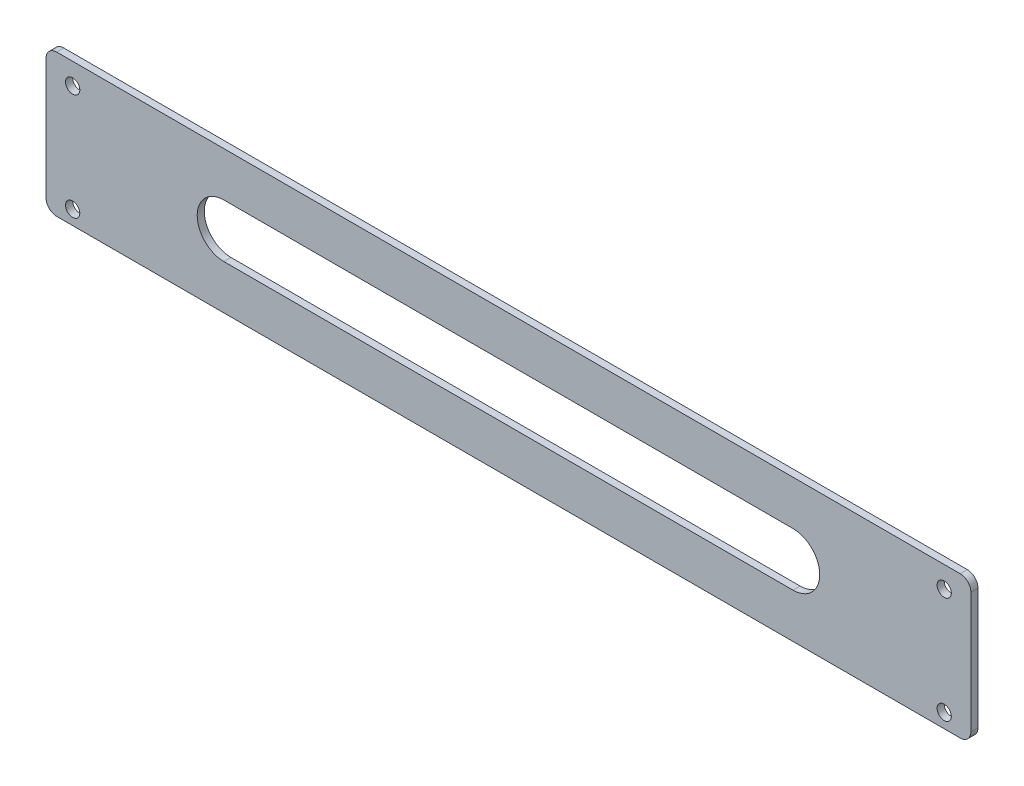
ISO-10303-21;
HEADER;
FILE_DESCRIPTION(('STEP AP214'),'2;1');
FILE_NAME('part.step','',(''),(''),'','','');
FILE_SCHEMA(('AUTOMOTIVE_DESIGN { 1 0 10303 214 1 1 1 1 }'));
ENDSEC;
DATA;
#1=APPLICATION_CONTEXT('core data for automotive mechanical design processes');
#2=APPLICATION_PROTOCOL_DEFINITION('international standard','automotive_design',2000,#1);
#3=PRODUCT_CONTEXT('',#1,'mechanical');
#4=PRODUCT('Part','Part','',(#3));
#5=PRODUCT_RELATED_PRODUCT_CATEGORY('part','',(#4));
#6=PRODUCT_DEFINITION_FORMATION('','',#4);
#7=PRODUCT_DEFINITION_CONTEXT('part definition',#1,'design');
#8=PRODUCT_DEFINITION('design','',#6,#7);
#9=PRODUCT_DEFINITION_SHAPE('','',#8);
#10=(LENGTH_UNIT() NAMED_UNIT(*) SI_UNIT(.MILLI.,.METRE.));
#11=(NAMED_UNIT(*) PLANE_ANGLE_UNIT() SI_UNIT($,.RADIAN.));
#12=(NAMED_UNIT(*) SI_UNIT($,.STERADIAN.) SOLID_ANGLE_UNIT());
#13=UNCERTAINTY_MEASURE_WITH_UNIT(LENGTH_MEASURE(1.E-05),#10,'distance_accuracy_value','');
#14=(GEOMETRIC_REPRESENTATION_CONTEXT(3) GLOBAL_UNCERTAINTY_ASSIGNED_CONTEXT((#13)) GLOBAL_UNIT_ASSIGNED_CONTEXT((#10,
#11,#12)) REPRESENTATION_CONTEXT('',''));
#15=CARTESIAN_POINT('',(0.,0.,0.));
#16=DIRECTION('',(0.,0.,1.));
#17=DIRECTION('',(1.,0.,0.));
#18=AXIS2_PLACEMENT_3D('',#15,#16,#17);
#19=CARTESIAN_POINT('',(130.,20.,2.));
#20=DIRECTION('',(-1.,0.,0.));
#21=DIRECTION('',(0.,0.,1.));
#22=AXIS2_PLACEMENT_3D('',#19,#20,#21);
#23=PLANE('',#22);
#24=DIRECTION('',(0.,1.,0.));
#25=VECTOR('',#24,1.);
#26=CARTESIAN_POINT('',(130.,20.,2.));
#27=LINE('',#26,#25);
#28=CARTESIAN_POINT('',(130.,-17.,2.));
#29=VERTEX_POINT('',#28);
#30=CARTESIAN_POINT('',(130.,17.,2.));
#31=VERTEX_POINT('',#30);
#32=EDGE_CURVE('E192',#29,#31,#27,.T.);
#33=ORIENTED_EDGE('',*,*,#32,.F.);
#34=DIRECTION('',(0.,0.,-1.));
#35=VECTOR('',#34,1.);
#36=CARTESIAN_POINT('',(130.,-17.,2.));
#37=LINE('',#36,#35);
#38=CARTESIAN_POINT('',(130.,-17.,0.));
#39=VERTEX_POINT('',#38);
#40=EDGE_CURVE('E214',#29,#39,#37,.T.);
#41=ORIENTED_EDGE('',*,*,#40,.T.);
#42=DIRECTION('',(0.,1.,0.));
#43=VECTOR('',#42,1.);
#44=CARTESIAN_POINT('',(130.,20.,0.));
#45=LINE('',#44,#43);
#46=CARTESIAN_POINT('',(130.,17.,0.));
#47=VERTEX_POINT('',#46);
#48=EDGE_CURVE('E189',#39,#47,#45,.T.);
#49=ORIENTED_EDGE('',*,*,#48,.T.);
#50=DIRECTION('',(0.,0.,-1.));
#51=VECTOR('',#50,1.);
#52=CARTESIAN_POINT('',(130.,17.,2.));
#53=LINE('',#52,#51);
#54=EDGE_CURVE('E203',#47,#31,#53,.F.);
#55=ORIENTED_EDGE('',*,*,#54,.T.);
#56=EDGE_LOOP('',(#33,#41,#49,#55));
#57=FACE_BOUND('',#56,.T.);
#58=ADVANCED_FACE('F33',(#57),#23,.F.);
#59=CARTESIAN_POINT('',(-130.,20.,2.));
#60=DIRECTION('',(0.,-1.,0.));
#61=DIRECTION('',(0.,0.,-1.));
#62=AXIS2_PLACEMENT_3D('',#59,#60,#61);
#63=PLANE('',#62);
#64=DIRECTION('',(-1.,0.,0.));
#65=VECTOR('',#64,1.);
#66=CARTESIAN_POINT('',(-130.,20.,2.));
#67=LINE('',#66,#65);
#68=CARTESIAN_POINT('',(127.,20.,2.));
#69=VERTEX_POINT('',#68);
#70=CARTESIAN_POINT('',(-127.,20.,2.));
#71=VERTEX_POINT('',#70);
#72=EDGE_CURVE('E195',#69,#71,#67,.T.);
#73=ORIENTED_EDGE('',*,*,#72,.F.);
#74=DIRECTION('',(0.,0.,-1.));
#75=VECTOR('',#74,1.);
#76=CARTESIAN_POINT('',(127.,20.,2.));
#77=LINE('',#76,#75);
#78=CARTESIAN_POINT('',(127.,20.,0.));
#79=VERTEX_POINT('',#78);
#80=EDGE_CURVE('E11',#69,#79,#77,.T.);
#81=ORIENTED_EDGE('',*,*,#80,.T.);
#82=DIRECTION('',(-1.,0.,0.));
#83=VECTOR('',#82,1.);
#84=CARTESIAN_POINT('',(-130.,20.,0.));
#85=LINE('',#84,#83);
#86=CARTESIAN_POINT('',(-127.,20.,0.));
#87=VERTEX_POINT('',#86);
#88=EDGE_CURVE('E206',#79,#87,#85,.T.);
#89=ORIENTED_EDGE('',*,*,#88,.T.);
#90=DIRECTION('',(0.,0.,-1.));
#91=VECTOR('',#90,1.);
#92=CARTESIAN_POINT('',(-127.,20.,2.));
#93=LINE('',#92,#91);
#94=EDGE_CURVE('E41',#87,#71,#93,.F.);
#95=ORIENTED_EDGE('',*,*,#94,.T.);
#96=EDGE_LOOP('',(#73,#81,#89,#95));
#97=FACE_BOUND('',#96,.T.);
#98=ADVANCED_FACE('F243',(#97),#63,.F.);
#99=CARTESIAN_POINT('',(-130.,20.,2.));
#100=DIRECTION('',(1.,0.,0.));
#101=DIRECTION('',(0.,0.,-1.));
#102=AXIS2_PLACEMENT_3D('',#99,#100,#101);
#103=PLANE('',#102);
#104=DIRECTION('',(0.,-1.,0.));
#105=VECTOR('',#104,1.);
#106=CARTESIAN_POINT('',(-130.,20.,0.));
#107=LINE('',#106,#105);
#108=CARTESIAN_POINT('',(-130.,17.,0.));
#109=VERTEX_POINT('',#108);
#110=CARTESIAN_POINT('',(-130.,-17.,0.));
#111=VERTEX_POINT('',#110);
#112=EDGE_CURVE('E209',#109,#111,#107,.T.);
#113=ORIENTED_EDGE('',*,*,#112,.T.);
#114=DIRECTION('',(0.,0.,-1.));
#115=VECTOR('',#114,1.);
#116=CARTESIAN_POINT('',(-130.,-17.,2.));
#117=LINE('',#116,#115);
#118=CARTESIAN_POINT('',(-130.,-17.,2.));
#119=VERTEX_POINT('',#118);
#120=EDGE_CURVE('E48',#111,#119,#117,.F.);
#121=ORIENTED_EDGE('',*,*,#120,.T.);
#122=DIRECTION('',(0.,-1.,0.));
#123=VECTOR('',#122,1.);
#124=CARTESIAN_POINT('',(-130.,20.,2.));
#125=LINE('',#124,#123);
#126=CARTESIAN_POINT('',(-130.,17.,2.));
#127=VERTEX_POINT('',#126);
#128=EDGE_CURVE('E198',#127,#119,#125,.T.);
#129=ORIENTED_EDGE('',*,*,#128,.F.);
#130=DIRECTION('',(0.,0.,-1.));
#131=VECTOR('',#130,1.);
#132=CARTESIAN_POINT('',(-130.,17.,2.));
#133=LINE('',#132,#131);
#134=EDGE_CURVE('E237',#127,#109,#133,.T.);
#135=ORIENTED_EDGE('',*,*,#134,.T.);
#136=EDGE_LOOP('',(#113,#121,#129,#135));
#137=FACE_BOUND('',#136,.T.);
#138=ADVANCED_FACE('F251',(#137),#103,.F.);
#139=CARTESIAN_POINT('',(-130.,-20.,2.));
#140=DIRECTION('',(0.,1.,0.));
#141=DIRECTION('',(0.,0.,1.));
#142=AXIS2_PLACEMENT_3D('',#139,#140,#141);
#143=PLANE('',#142);
#144=DIRECTION('',(1.,0.,0.));
#145=VECTOR('',#144,1.);
#146=CARTESIAN_POINT('',(-130.,-20.,0.));
#147=LINE('',#146,#145);
#148=CARTESIAN_POINT('',(-127.,-20.,0.));
#149=VERTEX_POINT('',#148);
#150=CARTESIAN_POINT('',(127.,-20.,0.));
#151=VERTEX_POINT('',#150);
#152=EDGE_CURVE('E196',#149,#151,#147,.T.);
#153=ORIENTED_EDGE('',*,*,#152,.T.);
#154=DIRECTION('',(0.,0.,-1.));
#155=VECTOR('',#154,1.);
#156=CARTESIAN_POINT('',(127.,-20.,2.));
#157=LINE('',#156,#155);
#158=CARTESIAN_POINT('',(127.,-20.,2.));
#159=VERTEX_POINT('',#158);
#160=EDGE_CURVE('E228',#151,#159,#157,.F.);
#161=ORIENTED_EDGE('',*,*,#160,.T.);
#162=DIRECTION('',(1.,0.,0.));
#163=VECTOR('',#162,1.);
#164=CARTESIAN_POINT('',(-130.,-20.,2.));
#165=LINE('',#164,#163);
#166=CARTESIAN_POINT('',(-127.,-20.,2.));
#167=VERTEX_POINT('',#166);
#168=EDGE_CURVE('E200',#167,#159,#165,.T.);
#169=ORIENTED_EDGE('',*,*,#168,.F.);
#170=DIRECTION('',(0.,0.,-1.));
#171=VECTOR('',#170,1.);
#172=CARTESIAN_POINT('',(-127.,-20.,2.));
#173=LINE('',#172,#171);
#174=EDGE_CURVE('E225',#167,#149,#173,.T.);
#175=ORIENTED_EDGE('',*,*,#174,.T.);
#176=EDGE_LOOP('',(#153,#161,#169,#175));
#177=FACE_BOUND('',#176,.T.);
#178=ADVANCED_FACE('F261',(#177),#143,.F.);
#179=CARTESIAN_POINT('',(0.,0.,2.));
#180=DIRECTION('',(0.,0.,1.));
#181=DIRECTION('',(1.,0.,0.));
#182=AXIS2_PLACEMENT_3D('',#179,#180,#181);
#183=PLANE('',#182);
#184=CARTESIAN_POINT('',(-80.,0.,2.));
#185=DIRECTION('',(0.,0.,1.));
#186=DIRECTION('',(1.,0.,0.));
#187=AXIS2_PLACEMENT_3D('',#184,#185,#186);
#188=CIRCLE('',#187,7.5);
#189=CARTESIAN_POINT('',(-80.,7.5,2.));
#190=VERTEX_POINT('',#189);
#191=CARTESIAN_POINT('',(-80.,-7.5,2.));
#192=VERTEX_POINT('',#191);
#193=EDGE_CURVE('E131',#190,#192,#188,.T.);
#194=ORIENTED_EDGE('',*,*,#193,.F.);
#195=DIRECTION('',(-1.,0.,0.));
#196=VECTOR('',#195,1.);
#197=CARTESIAN_POINT('',(-80.,7.5,2.));
#198=LINE('',#197,#196);
#199=CARTESIAN_POINT('',(80.,7.50000000000003,2.));
#200=VERTEX_POINT('',#199);
#201=EDGE_CURVE('E149',#200,#190,#198,.T.);
#202=ORIENTED_EDGE('',*,*,#201,.F.);
#203=CARTESIAN_POINT('',(80.,0.,2.));
#204=DIRECTION('',(0.,0.,1.));
#205=DIRECTION('',(1.,0.,0.));
#206=AXIS2_PLACEMENT_3D('',#203,#204,#205);
#207=CIRCLE('',#206,7.5);
#208=CARTESIAN_POINT('',(80.,-7.49999999999997,2.));
#209=VERTEX_POINT('',#208);
#210=EDGE_CURVE('E152',#209,#200,#207,.T.);
#211=ORIENTED_EDGE('',*,*,#210,.F.);
#212=DIRECTION('',(1.,0.,0.));
#213=VECTOR('',#212,1.);
#214=CARTESIAN_POINT('',(-80.,-7.5,2.));
#215=LINE('',#214,#213);
#216=EDGE_CURVE('E158',#192,#209,#215,.T.);
#217=ORIENTED_EDGE('',*,*,#216,.F.);
#218=EDGE_LOOP('',(#194,#202,#211,#217));
#219=FACE_BOUND('',#218,.T.);
#220=CARTESIAN_POINT('',(-122.5,-16.,2.));
#221=DIRECTION('',(0.,0.,1.));
#222=DIRECTION('',(1.,0.,0.));
#223=AXIS2_PLACEMENT_3D('',#220,#221,#222);
#224=CIRCLE('',#223,2.);
#225=CARTESIAN_POINT('',(-120.5,-16.,2.));
#226=VERTEX_POINT('',#225);
#227=EDGE_CURVE('E172',#226,#226,#224,.T.);
#228=ORIENTED_EDGE('',*,*,#227,.F.);
#229=EDGE_LOOP('',(#228));
#230=FACE_BOUND('',#229,.T.);
#231=CARTESIAN_POINT('',(122.5,-16.,2.));
#232=DIRECTION('',(0.,0.,1.));
#233=DIRECTION('',(-1.,0.,0.));
#234=AXIS2_PLACEMENT_3D('',#231,#232,#233);
#235=CIRCLE('',#234,2.);
#236=CARTESIAN_POINT('',(120.5,-16.,2.));
#237=VERTEX_POINT('',#236);
#238=EDGE_CURVE('E178',#237,#237,#235,.T.);
#239=ORIENTED_EDGE('',*,*,#238,.F.);
#240=EDGE_LOOP('',(#239));
#241=FACE_BOUND('',#240,.T.);
#242=CARTESIAN_POINT('',(122.5,14.,2.));
#243=DIRECTION('',(0.,0.,1.));
#244=DIRECTION('',(-1.,0.,0.));
#245=AXIS2_PLACEMENT_3D('',#242,#243,#244);
#246=CIRCLE('',#245,2.);
#247=CARTESIAN_POINT('',(120.5,14.,2.));
#248=VERTEX_POINT('',#247);
#249=EDGE_CURVE('E164',#248,#248,#246,.T.);
#250=ORIENTED_EDGE('',*,*,#249,.F.);
#251=EDGE_LOOP('',(#250));
#252=FACE_BOUND('',#251,.T.);
#253=CARTESIAN_POINT('',(-122.5,14.,2.));
#254=DIRECTION('',(0.,0.,1.));
#255=DIRECTION('',(1.,0.,0.));
#256=AXIS2_PLACEMENT_3D('',#253,#254,#255);
#257=CIRCLE('',#256,2.);
#258=CARTESIAN_POINT('',(-120.5,14.,2.));
#259=VERTEX_POINT('',#258);
#260=EDGE_CURVE('E171',#259,#259,#257,.T.);
#261=ORIENTED_EDGE('',*,*,#260,.F.);
#262=EDGE_LOOP('',(#261));
#263=FACE_BOUND('',#262,.T.);
#264=ORIENTED_EDGE('',*,*,#168,.T.);
#265=CARTESIAN_POINT('',(127.,-17.,2.));
#266=DIRECTION('',(0.,0.,1.));
#267=DIRECTION('',(1.,0.,0.));
#268=AXIS2_PLACEMENT_3D('',#265,#266,#267);
#269=CIRCLE('',#268,3.);
#270=EDGE_CURVE('E235',#159,#29,#269,.T.);
#271=ORIENTED_EDGE('',*,*,#270,.T.);
#272=ORIENTED_EDGE('',*,*,#32,.T.);
#273=CARTESIAN_POINT('',(127.,17.,2.));
#274=DIRECTION('',(0.,0.,1.));
#275=DIRECTION('',(1.,0.,0.));
#276=AXIS2_PLACEMENT_3D('',#273,#274,#275);
#277=CIRCLE('',#276,3.);
#278=EDGE_CURVE('E231',#31,#69,#277,.T.);
#279=ORIENTED_EDGE('',*,*,#278,.T.);
#280=ORIENTED_EDGE('',*,*,#72,.T.);
#281=CARTESIAN_POINT('',(-127.,17.,2.));
#282=DIRECTION('',(0.,0.,1.));
#283=DIRECTION('',(1.,0.,0.));
#284=AXIS2_PLACEMENT_3D('',#281,#282,#283);
#285=CIRCLE('',#284,3.);
#286=EDGE_CURVE('E55',#71,#127,#285,.T.);
#287=ORIENTED_EDGE('',*,*,#286,.T.);
#288=ORIENTED_EDGE('',*,*,#128,.T.);
#289=CARTESIAN_POINT('',(-127.,-17.,2.));
#290=DIRECTION('',(0.,0.,1.));
#291=DIRECTION('',(1.,0.,0.));
#292=AXIS2_PLACEMENT_3D('',#289,#290,#291);
#293=CIRCLE('',#292,3.);
#294=EDGE_CURVE('E233',#119,#167,#293,.T.);
#295=ORIENTED_EDGE('',*,*,#294,.T.);
#296=EDGE_LOOP('',(#264,#271,#272,#279,#280,#287,#288,#295));
#297=FACE_BOUND('',#296,.T.);
#298=ADVANCED_FACE('F247',(#219,#230,#241,#252,#263,#297),#183,.T.);
#299=CARTESIAN_POINT('',(0.,0.,0.));
#300=DIRECTION('',(0.,0.,1.));
#301=DIRECTION('',(1.,0.,0.));
#302=AXIS2_PLACEMENT_3D('',#299,#300,#301);
#303=PLANE('',#302);
#304=DIRECTION('',(-1.,0.,0.));
#305=VECTOR('',#304,1.);
#306=CARTESIAN_POINT('',(-80.,7.5,0.));
#307=LINE('',#306,#305);
#308=CARTESIAN_POINT('',(80.,7.50000000000003,0.));
#309=VERTEX_POINT('',#308);
#310=CARTESIAN_POINT('',(-80.,7.5,0.));
#311=VERTEX_POINT('',#310);
#312=EDGE_CURVE('E136',#309,#311,#307,.T.);
#313=ORIENTED_EDGE('',*,*,#312,.T.);
#314=CARTESIAN_POINT('',(-80.,0.,0.));
#315=DIRECTION('',(0.,0.,1.));
#316=DIRECTION('',(1.,0.,0.));
#317=AXIS2_PLACEMENT_3D('',#314,#315,#316);
#318=CIRCLE('',#317,7.5);
#319=CARTESIAN_POINT('',(-80.,-7.5,0.));
#320=VERTEX_POINT('',#319);
#321=EDGE_CURVE('E128',#311,#320,#318,.T.);
#322=ORIENTED_EDGE('',*,*,#321,.T.);
#323=DIRECTION('',(1.,0.,0.));
#324=VECTOR('',#323,1.);
#325=CARTESIAN_POINT('',(-80.,-7.5,0.));
#326=LINE('',#325,#324);
#327=CARTESIAN_POINT('',(80.,-7.49999999999997,0.));
#328=VERTEX_POINT('',#327);
#329=EDGE_CURVE('E140',#320,#328,#326,.T.);
#330=ORIENTED_EDGE('',*,*,#329,.T.);
#331=CARTESIAN_POINT('',(80.,0.,0.));
#332=DIRECTION('',(0.,0.,1.));
#333=DIRECTION('',(1.,0.,0.));
#334=AXIS2_PLACEMENT_3D('',#331,#332,#333);
#335=CIRCLE('',#334,7.5);
#336=EDGE_CURVE('E144',#328,#309,#335,.T.);
#337=ORIENTED_EDGE('',*,*,#336,.T.);
#338=EDGE_LOOP('',(#313,#322,#330,#337));
#339=FACE_BOUND('',#338,.T.);
#340=CARTESIAN_POINT('',(-122.5,-16.,0.));
#341=DIRECTION('',(0.,0.,1.));
#342=DIRECTION('',(1.,0.,0.));
#343=AXIS2_PLACEMENT_3D('',#340,#341,#342);
#344=CIRCLE('',#343,2.);
#345=CARTESIAN_POINT('',(-120.5,-16.,0.));
#346=VERTEX_POINT('',#345);
#347=EDGE_CURVE('E168',#346,#346,#344,.T.);
#348=ORIENTED_EDGE('',*,*,#347,.T.);
#349=EDGE_LOOP('',(#348));
#350=FACE_BOUND('',#349,.T.);
#351=CARTESIAN_POINT('',(122.5,-16.,0.));
#352=DIRECTION('',(0.,0.,1.));
#353=DIRECTION('',(-1.,0.,0.));
#354=AXIS2_PLACEMENT_3D('',#351,#352,#353);
#355=CIRCLE('',#354,2.);
#356=CARTESIAN_POINT('',(120.5,-16.,0.));
#357=VERTEX_POINT('',#356);
#358=EDGE_CURVE('E175',#357,#357,#355,.T.);
#359=ORIENTED_EDGE('',*,*,#358,.T.);
#360=EDGE_LOOP('',(#359));
#361=FACE_BOUND('',#360,.T.);
#362=CARTESIAN_POINT('',(122.5,14.,0.));
#363=DIRECTION('',(0.,0.,1.));
#364=DIRECTION('',(-1.,0.,0.));
#365=AXIS2_PLACEMENT_3D('',#362,#363,#364);
#366=CIRCLE('',#365,2.);
#367=CARTESIAN_POINT('',(120.5,14.,0.));
#368=VERTEX_POINT('',#367);
#369=EDGE_CURVE('E181',#368,#368,#366,.T.);
#370=ORIENTED_EDGE('',*,*,#369,.T.);
#371=EDGE_LOOP('',(#370));
#372=FACE_BOUND('',#371,.T.);
#373=CARTESIAN_POINT('',(-122.5,14.,0.));
#374=DIRECTION('',(0.,0.,1.));
#375=DIRECTION('',(1.,0.,0.));
#376=AXIS2_PLACEMENT_3D('',#373,#374,#375);
#377=CIRCLE('',#376,2.);
#378=CARTESIAN_POINT('',(-120.5,14.,0.));
#379=VERTEX_POINT('',#378);
#380=EDGE_CURVE('E186',#379,#379,#377,.T.);
#381=ORIENTED_EDGE('',*,*,#380,.T.);
#382=EDGE_LOOP('',(#381));
#383=FACE_BOUND('',#382,.T.);
#384=ORIENTED_EDGE('',*,*,#48,.F.);
#385=CARTESIAN_POINT('',(127.,-17.,0.));
#386=DIRECTION('',(0.,0.,1.));
#387=DIRECTION('',(1.,0.,0.));
#388=AXIS2_PLACEMENT_3D('',#385,#386,#387);
#389=CIRCLE('',#388,3.);
#390=EDGE_CURVE('E223',#39,#151,#389,.F.);
#391=ORIENTED_EDGE('',*,*,#390,.T.);
#392=ORIENTED_EDGE('',*,*,#152,.F.);
#393=CARTESIAN_POINT('',(-127.,-17.,0.));
#394=DIRECTION('',(0.,0.,1.));
#395=DIRECTION('',(1.,0.,0.));
#396=AXIS2_PLACEMENT_3D('',#393,#394,#395);
#397=CIRCLE('',#396,3.);
#398=EDGE_CURVE('E221',#149,#111,#397,.F.);
#399=ORIENTED_EDGE('',*,*,#398,.T.);
#400=ORIENTED_EDGE('',*,*,#112,.F.);
#401=CARTESIAN_POINT('',(-127.,17.,0.));
#402=DIRECTION('',(0.,0.,1.));
#403=DIRECTION('',(1.,0.,0.));
#404=AXIS2_PLACEMENT_3D('',#401,#402,#403);
#405=CIRCLE('',#404,3.);
#406=EDGE_CURVE('E217',#109,#87,#405,.F.);
#407=ORIENTED_EDGE('',*,*,#406,.T.);
#408=ORIENTED_EDGE('',*,*,#88,.F.);
#409=CARTESIAN_POINT('',(127.,17.,0.));
#410=DIRECTION('',(0.,0.,1.));
#411=DIRECTION('',(1.,0.,0.));
#412=AXIS2_PLACEMENT_3D('',#409,#410,#411);
#413=CIRCLE('',#412,3.);
#414=EDGE_CURVE('E219',#79,#47,#413,.F.);
#415=ORIENTED_EDGE('',*,*,#414,.T.);
#416=EDGE_LOOP('',(#384,#391,#392,#399,#400,#407,#408,#415));
#417=FACE_BOUND('',#416,.T.);
#418=ADVANCED_FACE('F146',(#339,#350,#361,#372,#383,#417),#303,.F.);
#419=CARTESIAN_POINT('',(-122.5,14.,0.));
#420=DIRECTION('',(0.,0.,1.));
#421=DIRECTION('',(1.,0.,0.));
#422=AXIS2_PLACEMENT_3D('',#419,#420,#421);
#423=CYLINDRICAL_SURFACE('',#422,2.);
#424=ORIENTED_EDGE('',*,*,#380,.F.);
#425=EDGE_LOOP('',(#424));
#426=FACE_BOUND('',#425,.T.);
#427=ORIENTED_EDGE('',*,*,#260,.T.);
#428=EDGE_LOOP('',(#427));
#429=FACE_BOUND('',#428,.T.);
#430=ADVANCED_FACE('F313',(#426,#429),#423,.F.);
#431=CARTESIAN_POINT('',(122.5,14.,0.));
#432=DIRECTION('',(0.,0.,1.));
#433=DIRECTION('',(1.,0.,0.));
#434=AXIS2_PLACEMENT_3D('',#431,#432,#433);
#435=CYLINDRICAL_SURFACE('',#434,2.);
#436=ORIENTED_EDGE('',*,*,#369,.F.);
#437=EDGE_LOOP('',(#436));
#438=FACE_BOUND('',#437,.T.);
#439=ORIENTED_EDGE('',*,*,#249,.T.);
#440=EDGE_LOOP('',(#439));
#441=FACE_BOUND('',#440,.T.);
#442=ADVANCED_FACE('F309',(#438,#441),#435,.F.);
#443=CARTESIAN_POINT('',(122.5,-16.,0.));
#444=DIRECTION('',(0.,0.,1.));
#445=DIRECTION('',(1.,0.,0.));
#446=AXIS2_PLACEMENT_3D('',#443,#444,#445);
#447=CYLINDRICAL_SURFACE('',#446,2.);
#448=ORIENTED_EDGE('',*,*,#358,.F.);
#449=EDGE_LOOP('',(#448));
#450=FACE_BOUND('',#449,.T.);
#451=ORIENTED_EDGE('',*,*,#238,.T.);
#452=EDGE_LOOP('',(#451));
#453=FACE_BOUND('',#452,.T.);
#454=ADVANCED_FACE('F305',(#450,#453),#447,.F.);
#455=CARTESIAN_POINT('',(-122.5,-16.,0.));
#456=DIRECTION('',(0.,0.,1.));
#457=DIRECTION('',(1.,0.,0.));
#458=AXIS2_PLACEMENT_3D('',#455,#456,#457);
#459=CYLINDRICAL_SURFACE('',#458,2.);
#460=ORIENTED_EDGE('',*,*,#347,.F.);
#461=EDGE_LOOP('',(#460));
#462=FACE_BOUND('',#461,.T.);
#463=ORIENTED_EDGE('',*,*,#227,.T.);
#464=EDGE_LOOP('',(#463));
#465=FACE_BOUND('',#464,.T.);
#466=ADVANCED_FACE('F302',(#462,#465),#459,.F.);
#467=CARTESIAN_POINT('',(-80.,0.,0.));
#468=DIRECTION('',(0.,0.,1.));
#469=DIRECTION('',(1.,0.,0.));
#470=AXIS2_PLACEMENT_3D('',#467,#468,#469);
#471=CYLINDRICAL_SURFACE('',#470,7.5);
#472=ORIENTED_EDGE('',*,*,#193,.T.);
#473=DIRECTION('',(0.,0.,1.));
#474=VECTOR('',#473,1.);
#475=CARTESIAN_POINT('',(-80.,-7.5,0.));
#476=LINE('',#475,#474);
#477=EDGE_CURVE('E124',#320,#192,#476,.T.);
#478=ORIENTED_EDGE('',*,*,#477,.F.);
#479=ORIENTED_EDGE('',*,*,#321,.F.);
#480=DIRECTION('',(0.,0.,1.));
#481=VECTOR('',#480,1.);
#482=CARTESIAN_POINT('',(-80.,7.5,0.));
#483=LINE('',#482,#481);
#484=EDGE_CURVE('E162',#311,#190,#483,.T.);
#485=ORIENTED_EDGE('',*,*,#484,.T.);
#486=EDGE_LOOP('',(#472,#478,#479,#485));
#487=FACE_BOUND('',#486,.T.);
#488=ADVANCED_FACE('F126',(#487),#471,.F.);
#489=CARTESIAN_POINT('',(-80.,7.5,0.));
#490=DIRECTION('',(0.,1.,0.));
#491=DIRECTION('',(-1.,0.,0.));
#492=AXIS2_PLACEMENT_3D('',#489,#490,#491);
#493=PLANE('',#492);
#494=ORIENTED_EDGE('',*,*,#201,.T.);
#495=ORIENTED_EDGE('',*,*,#484,.F.);
#496=ORIENTED_EDGE('',*,*,#312,.F.);
#497=DIRECTION('',(0.,0.,1.));
#498=VECTOR('',#497,1.);
#499=CARTESIAN_POINT('',(80.,7.50000000000003,0.));
#500=LINE('',#499,#498);
#501=EDGE_CURVE('E165',#309,#200,#500,.T.);
#502=ORIENTED_EDGE('',*,*,#501,.T.);
#503=EDGE_LOOP('',(#494,#495,#496,#502));
#504=FACE_BOUND('',#503,.T.);
#505=ADVANCED_FACE('F295',(#504),#493,.F.);
#506=CARTESIAN_POINT('',(80.,0.,0.));
#507=DIRECTION('',(0.,0.,1.));
#508=DIRECTION('',(1.,0.,0.));
#509=AXIS2_PLACEMENT_3D('',#506,#507,#508);
#510=CYLINDRICAL_SURFACE('',#509,7.5);
#511=ORIENTED_EDGE('',*,*,#210,.T.);
#512=ORIENTED_EDGE('',*,*,#501,.F.);
#513=ORIENTED_EDGE('',*,*,#336,.F.);
#514=DIRECTION('',(0.,0.,1.));
#515=VECTOR('',#514,1.);
#516=CARTESIAN_POINT('',(80.,-7.49999999999997,0.));
#517=LINE('',#516,#515);
#518=EDGE_CURVE('E135',#328,#209,#517,.T.);
#519=ORIENTED_EDGE('',*,*,#518,.T.);
#520=EDGE_LOOP('',(#511,#512,#513,#519));
#521=FACE_BOUND('',#520,.T.);
#522=ADVANCED_FACE('F290',(#521),#510,.F.);
#523=CARTESIAN_POINT('',(-80.,-7.5,0.));
#524=DIRECTION('',(0.,-1.,0.));
#525=DIRECTION('',(1.,0.,0.));
#526=AXIS2_PLACEMENT_3D('',#523,#524,#525);
#527=PLANE('',#526);
#528=ORIENTED_EDGE('',*,*,#216,.T.);
#529=ORIENTED_EDGE('',*,*,#518,.F.);
#530=ORIENTED_EDGE('',*,*,#329,.F.);
#531=ORIENTED_EDGE('',*,*,#477,.T.);
#532=EDGE_LOOP('',(#528,#529,#530,#531));
#533=FACE_BOUND('',#532,.T.);
#534=ADVANCED_FACE('F141',(#533),#527,.F.);
#535=CARTESIAN_POINT('',(127.,-17.,2.));
#536=DIRECTION('',(0.,0.,-1.));
#537=DIRECTION('',(-1.,0.,0.));
#538=AXIS2_PLACEMENT_3D('',#535,#536,#537);
#539=CYLINDRICAL_SURFACE('',#538,3.);
#540=ORIENTED_EDGE('',*,*,#270,.F.);
#541=ORIENTED_EDGE('',*,*,#160,.F.);
#542=ORIENTED_EDGE('',*,*,#390,.F.);
#543=ORIENTED_EDGE('',*,*,#40,.F.);
#544=EDGE_LOOP('',(#540,#541,#542,#543));
#545=FACE_BOUND('',#544,.T.);
#546=ADVANCED_FACE('F267',(#545),#539,.T.);
#547=CARTESIAN_POINT('',(-127.,-17.,2.));
#548=DIRECTION('',(0.,0.,-1.));
#549=DIRECTION('',(-1.,0.,0.));
#550=AXIS2_PLACEMENT_3D('',#547,#548,#549);
#551=CYLINDRICAL_SURFACE('',#550,3.);
#552=ORIENTED_EDGE('',*,*,#294,.F.);
#553=ORIENTED_EDGE('',*,*,#120,.F.);
#554=ORIENTED_EDGE('',*,*,#398,.F.);
#555=ORIENTED_EDGE('',*,*,#174,.F.);
#556=EDGE_LOOP('',(#552,#553,#554,#555));
#557=FACE_BOUND('',#556,.T.);
#558=ADVANCED_FACE('F258',(#557),#551,.T.);
#559=CARTESIAN_POINT('',(127.,17.,2.));
#560=DIRECTION('',(0.,0.,-1.));
#561=DIRECTION('',(-1.,0.,0.));
#562=AXIS2_PLACEMENT_3D('',#559,#560,#561);
#563=CYLINDRICAL_SURFACE('',#562,3.);
#564=ORIENTED_EDGE('',*,*,#278,.F.);
#565=ORIENTED_EDGE('',*,*,#54,.F.);
#566=ORIENTED_EDGE('',*,*,#414,.F.);
#567=ORIENTED_EDGE('',*,*,#80,.F.);
#568=EDGE_LOOP('',(#564,#565,#566,#567));
#569=FACE_BOUND('',#568,.T.);
#570=ADVANCED_FACE('F271',(#569),#563,.T.);
#571=CARTESIAN_POINT('',(-127.,17.,2.));
#572=DIRECTION('',(0.,0.,-1.));
#573=DIRECTION('',(-1.,0.,0.));
#574=AXIS2_PLACEMENT_3D('',#571,#572,#573);
#575=CYLINDRICAL_SURFACE('',#574,3.);
#576=ORIENTED_EDGE('',*,*,#286,.F.);
#577=ORIENTED_EDGE('',*,*,#94,.F.);
#578=ORIENTED_EDGE('',*,*,#406,.F.);
#579=ORIENTED_EDGE('',*,*,#134,.F.);
#580=EDGE_LOOP('',(#576,#577,#578,#579));
#581=FACE_BOUND('',#580,.T.);
#582=ADVANCED_FACE('F35',(#581),#575,.T.);
#583=CLOSED_SHELL('',(#58,#98,#138,#178,#298,#418,#430,#442,#454,#466,#488,#505,#522,#534,#546,
#558,#570,#582));
#584=MANIFOLD_SOLID_BREP('B2',#583);
#585=ADVANCED_BREP_SHAPE_REPRESENTATION('',(#18,#584),#14);
#586=SHAPE_DEFINITION_REPRESENTATION(#9,#585);
ENDSEC;
END-ISO-10303-21;
